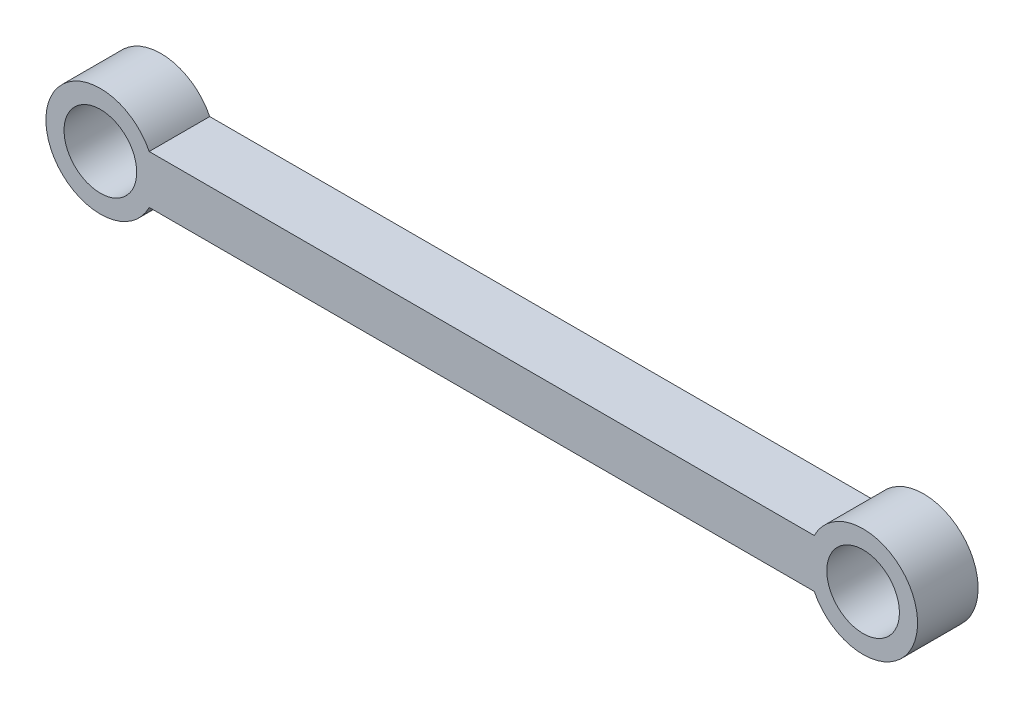
ISO-10303-21;
HEADER;
FILE_DESCRIPTION(('STEP AP214'),'2;1');
FILE_NAME('part.step','',(''),(''),'','','');
FILE_SCHEMA(('AUTOMOTIVE_DESIGN { 1 0 10303 214 1 1 1 1 }'));
ENDSEC;
DATA;
#1=APPLICATION_CONTEXT('core data for automotive mechanical design processes');
#2=APPLICATION_PROTOCOL_DEFINITION('international standard','automotive_design',2000,#1);
#3=PRODUCT_CONTEXT('',#1,'mechanical');
#4=PRODUCT('Part','Part','',(#3));
#5=PRODUCT_RELATED_PRODUCT_CATEGORY('part','',(#4));
#6=PRODUCT_DEFINITION_FORMATION('','',#4);
#7=PRODUCT_DEFINITION_CONTEXT('part definition',#1,'design');
#8=PRODUCT_DEFINITION('design','',#6,#7);
#9=PRODUCT_DEFINITION_SHAPE('','',#8);
#10=(LENGTH_UNIT() NAMED_UNIT(*) SI_UNIT(.MILLI.,.METRE.));
#11=(NAMED_UNIT(*) PLANE_ANGLE_UNIT() SI_UNIT($,.RADIAN.));
#12=(NAMED_UNIT(*) SI_UNIT($,.STERADIAN.) SOLID_ANGLE_UNIT());
#13=UNCERTAINTY_MEASURE_WITH_UNIT(LENGTH_MEASURE(1.E-05),#10,'distance_accuracy_value','');
#14=(GEOMETRIC_REPRESENTATION_CONTEXT(3) GLOBAL_UNCERTAINTY_ASSIGNED_CONTEXT((#13)) GLOBAL_UNIT_ASSIGNED_CONTEXT((#10,
#11,#12)) REPRESENTATION_CONTEXT('',''));
#15=CARTESIAN_POINT('',(0.,0.,0.));
#16=DIRECTION('',(0.,0.,1.));
#17=DIRECTION('',(1.,0.,0.));
#18=AXIS2_PLACEMENT_3D('',#15,#16,#17);
#19=CARTESIAN_POINT('',(0.,0.,6.35));
#20=DIRECTION('',(0.,0.,1.));
#21=DIRECTION('',(1.,0.,0.));
#22=AXIS2_PLACEMENT_3D('',#19,#20,#21);
#23=PLANE('',#22);
#24=CARTESIAN_POINT('',(0.,0.,6.35));
#25=DIRECTION('',(0.,0.,1.));
#26=DIRECTION('',(1.,0.,0.));
#27=AXIS2_PLACEMENT_3D('',#24,#25,#26);
#28=CIRCLE('',#27,3.81);
#29=CARTESIAN_POINT('',(3.81,0.,6.35));
#30=VERTEX_POINT('',#29);
#31=EDGE_CURVE('E100',#30,#30,#28,.T.);
#32=ORIENTED_EDGE('',*,*,#31,.F.);
#33=EDGE_LOOP('',(#32));
#34=FACE_BOUND('',#33,.T.);
#35=CARTESIAN_POINT('',(0.,0.,6.35));
#36=DIRECTION('',(0.,0.,1.));
#37=DIRECTION('',(1.,0.,0.));
#38=AXIS2_PLACEMENT_3D('',#35,#36,#37);
#39=CIRCLE('',#38,5.715);
#40=CARTESIAN_POINT('',(5.11953367016958,2.54,6.35));
#41=VERTEX_POINT('',#40);
#42=CARTESIAN_POINT('',(5.11953367016958,-2.54,6.35));
#43=VERTEX_POINT('',#42);
#44=EDGE_CURVE('E85',#41,#43,#39,.T.);
#45=ORIENTED_EDGE('',*,*,#44,.T.);
#46=DIRECTION('',(1.,0.,0.));
#47=VECTOR('',#46,1.);
#48=CARTESIAN_POINT('',(5.11953367016958,-2.54,6.35));
#49=LINE('',#48,#47);
#50=CARTESIAN_POINT('',(74.8904663298304,-2.54,6.35));
#51=VERTEX_POINT('',#50);
#52=EDGE_CURVE('E80',#43,#51,#49,.T.);
#53=ORIENTED_EDGE('',*,*,#52,.T.);
#54=CARTESIAN_POINT('',(80.01,0.,6.35));
#55=DIRECTION('',(0.,0.,1.));
#56=DIRECTION('',(1.,0.,0.));
#57=AXIS2_PLACEMENT_3D('',#54,#55,#56);
#58=CIRCLE('',#57,5.71499999999999);
#59=CARTESIAN_POINT('',(74.8904663298304,2.54,6.35));
#60=VERTEX_POINT('',#59);
#61=EDGE_CURVE('E83',#51,#60,#58,.T.);
#62=ORIENTED_EDGE('',*,*,#61,.T.);
#63=DIRECTION('',(-1.,0.,0.));
#64=VECTOR('',#63,1.);
#65=CARTESIAN_POINT('',(5.11953367016958,2.54,6.35));
#66=LINE('',#65,#64);
#67=EDGE_CURVE('E50',#60,#41,#66,.T.);
#68=ORIENTED_EDGE('',*,*,#67,.T.);
#69=EDGE_LOOP('',(#45,#53,#62,#68));
#70=FACE_BOUND('',#69,.T.);
#71=CARTESIAN_POINT('',(80.01,0.,6.35));
#72=DIRECTION('',(0.,0.,1.));
#73=DIRECTION('',(1.,0.,0.));
#74=AXIS2_PLACEMENT_3D('',#71,#72,#73);
#75=CIRCLE('',#74,3.81);
#76=CARTESIAN_POINT('',(83.82,0.,6.35));
#77=VERTEX_POINT('',#76);
#78=EDGE_CURVE('E115',#77,#77,#75,.T.);
#79=ORIENTED_EDGE('',*,*,#78,.F.);
#80=EDGE_LOOP('',(#79));
#81=FACE_BOUND('',#80,.T.);
#82=ADVANCED_FACE('F33',(#34,#70,#81),#23,.T.);
#83=CARTESIAN_POINT('',(0.,0.,0.));
#84=DIRECTION('',(0.,0.,1.));
#85=DIRECTION('',(1.,0.,0.));
#86=AXIS2_PLACEMENT_3D('',#83,#84,#85);
#87=PLANE('',#86);
#88=CARTESIAN_POINT('',(0.,0.,0.));
#89=DIRECTION('',(0.,0.,1.));
#90=DIRECTION('',(1.,0.,0.));
#91=AXIS2_PLACEMENT_3D('',#88,#89,#90);
#92=CIRCLE('',#91,5.715);
#93=CARTESIAN_POINT('',(5.11953367016958,2.54,0.));
#94=VERTEX_POINT('',#93);
#95=CARTESIAN_POINT('',(5.11953367016958,-2.54,0.));
#96=VERTEX_POINT('',#95);
#97=EDGE_CURVE('E97',#94,#96,#92,.T.);
#98=ORIENTED_EDGE('',*,*,#97,.F.);
#99=DIRECTION('',(-1.,0.,0.));
#100=VECTOR('',#99,1.);
#101=CARTESIAN_POINT('',(5.11953367016958,2.54,0.));
#102=LINE('',#101,#100);
#103=CARTESIAN_POINT('',(74.8904663298304,2.54,0.));
#104=VERTEX_POINT('',#103);
#105=EDGE_CURVE('E73',#104,#94,#102,.T.);
#106=ORIENTED_EDGE('',*,*,#105,.F.);
#107=CARTESIAN_POINT('',(80.01,0.,0.));
#108=DIRECTION('',(0.,0.,1.));
#109=DIRECTION('',(1.,0.,0.));
#110=AXIS2_PLACEMENT_3D('',#107,#108,#109);
#111=CIRCLE('',#110,5.71499999999999);
#112=CARTESIAN_POINT('',(74.8904663298304,-2.54,0.));
#113=VERTEX_POINT('',#112);
#114=EDGE_CURVE('E67',#113,#104,#111,.T.);
#115=ORIENTED_EDGE('',*,*,#114,.F.);
#116=DIRECTION('',(1.,0.,0.));
#117=VECTOR('',#116,1.);
#118=CARTESIAN_POINT('',(5.11953367016958,-2.54,0.));
#119=LINE('',#118,#117);
#120=EDGE_CURVE('E89',#96,#113,#119,.T.);
#121=ORIENTED_EDGE('',*,*,#120,.F.);
#122=EDGE_LOOP('',(#98,#106,#115,#121));
#123=FACE_BOUND('',#122,.T.);
#124=CARTESIAN_POINT('',(0.,0.,0.));
#125=DIRECTION('',(0.,0.,1.));
#126=DIRECTION('',(1.,0.,0.));
#127=AXIS2_PLACEMENT_3D('',#124,#125,#126);
#128=CIRCLE('',#127,3.81);
#129=CARTESIAN_POINT('',(3.81,0.,0.));
#130=VERTEX_POINT('',#129);
#131=EDGE_CURVE('E112',#130,#130,#128,.T.);
#132=ORIENTED_EDGE('',*,*,#131,.T.);
#133=EDGE_LOOP('',(#132));
#134=FACE_BOUND('',#133,.T.);
#135=CARTESIAN_POINT('',(80.01,0.,0.));
#136=DIRECTION('',(0.,0.,1.));
#137=DIRECTION('',(1.,0.,0.));
#138=AXIS2_PLACEMENT_3D('',#135,#136,#137);
#139=CIRCLE('',#138,3.81);
#140=CARTESIAN_POINT('',(83.82,0.,0.));
#141=VERTEX_POINT('',#140);
#142=EDGE_CURVE('E118',#141,#141,#139,.T.);
#143=ORIENTED_EDGE('',*,*,#142,.T.);
#144=EDGE_LOOP('',(#143));
#145=FACE_BOUND('',#144,.T.);
#146=ADVANCED_FACE('F108',(#123,#134,#145),#87,.F.);
#147=CARTESIAN_POINT('',(0.,0.,6.35));
#148=DIRECTION('',(0.,0.,-1.));
#149=DIRECTION('',(-1.,0.,0.));
#150=AXIS2_PLACEMENT_3D('',#147,#148,#149);
#151=CYLINDRICAL_SURFACE('',#150,5.715);
#152=ORIENTED_EDGE('',*,*,#97,.T.);
#153=DIRECTION('',(0.,0.,-1.));
#154=VECTOR('',#153,1.);
#155=CARTESIAN_POINT('',(5.11953367016958,-2.54,6.35));
#156=LINE('',#155,#154);
#157=EDGE_CURVE('E11',#43,#96,#156,.T.);
#158=ORIENTED_EDGE('',*,*,#157,.F.);
#159=ORIENTED_EDGE('',*,*,#44,.F.);
#160=DIRECTION('',(0.,0.,-1.));
#161=VECTOR('',#160,1.);
#162=CARTESIAN_POINT('',(5.11953367016958,2.54,6.35));
#163=LINE('',#162,#161);
#164=EDGE_CURVE('E93',#41,#94,#163,.T.);
#165=ORIENTED_EDGE('',*,*,#164,.T.);
#166=EDGE_LOOP('',(#152,#158,#159,#165));
#167=FACE_BOUND('',#166,.T.);
#168=ADVANCED_FACE('F35',(#167),#151,.T.);
#169=CARTESIAN_POINT('',(5.11953367016958,-2.54,6.35));
#170=DIRECTION('',(0.,1.,0.));
#171=DIRECTION('',(0.,0.,1.));
#172=AXIS2_PLACEMENT_3D('',#169,#170,#171);
#173=PLANE('',#172);
#174=ORIENTED_EDGE('',*,*,#120,.T.);
#175=DIRECTION('',(0.,0.,-1.));
#176=VECTOR('',#175,1.);
#177=CARTESIAN_POINT('',(74.8904663298304,-2.54,6.35));
#178=LINE('',#177,#176);
#179=EDGE_CURVE('E42',#51,#113,#178,.T.);
#180=ORIENTED_EDGE('',*,*,#179,.F.);
#181=ORIENTED_EDGE('',*,*,#52,.F.);
#182=ORIENTED_EDGE('',*,*,#157,.T.);
#183=EDGE_LOOP('',(#174,#180,#181,#182));
#184=FACE_BOUND('',#183,.T.);
#185=ADVANCED_FACE('F88',(#184),#173,.F.);
#186=CARTESIAN_POINT('',(80.01,0.,6.35));
#187=DIRECTION('',(0.,0.,-1.));
#188=DIRECTION('',(-1.,0.,0.));
#189=AXIS2_PLACEMENT_3D('',#186,#187,#188);
#190=CYLINDRICAL_SURFACE('',#189,5.71499999999999);
#191=ORIENTED_EDGE('',*,*,#114,.T.);
#192=DIRECTION('',(0.,0.,-1.));
#193=VECTOR('',#192,1.);
#194=CARTESIAN_POINT('',(74.8904663298304,2.54,6.35));
#195=LINE('',#194,#193);
#196=EDGE_CURVE('E90',#60,#104,#195,.T.);
#197=ORIENTED_EDGE('',*,*,#196,.F.);
#198=ORIENTED_EDGE('',*,*,#61,.F.);
#199=ORIENTED_EDGE('',*,*,#179,.T.);
#200=EDGE_LOOP('',(#191,#197,#198,#199));
#201=FACE_BOUND('',#200,.T.);
#202=ADVANCED_FACE('F91',(#201),#190,.T.);
#203=CARTESIAN_POINT('',(5.11953367016958,2.54,6.35));
#204=DIRECTION('',(0.,-1.,0.));
#205=DIRECTION('',(0.,0.,-1.));
#206=AXIS2_PLACEMENT_3D('',#203,#204,#205);
#207=PLANE('',#206);
#208=ORIENTED_EDGE('',*,*,#105,.T.);
#209=ORIENTED_EDGE('',*,*,#164,.F.);
#210=ORIENTED_EDGE('',*,*,#67,.F.);
#211=ORIENTED_EDGE('',*,*,#196,.T.);
#212=EDGE_LOOP('',(#208,#209,#210,#211));
#213=FACE_BOUND('',#212,.T.);
#214=ADVANCED_FACE('F105',(#213),#207,.F.);
#215=CARTESIAN_POINT('',(0.,0.,6.35));
#216=DIRECTION('',(0.,0.,-1.));
#217=DIRECTION('',(-1.,0.,0.));
#218=AXIS2_PLACEMENT_3D('',#215,#216,#217);
#219=CYLINDRICAL_SURFACE('',#218,3.81);
#220=ORIENTED_EDGE('',*,*,#31,.T.);
#221=EDGE_LOOP('',(#220));
#222=FACE_BOUND('',#221,.T.);
#223=ORIENTED_EDGE('',*,*,#131,.F.);
#224=EDGE_LOOP('',(#223));
#225=FACE_BOUND('',#224,.T.);
#226=ADVANCED_FACE('F135',(#222,#225),#219,.F.);
#227=CARTESIAN_POINT('',(80.01,0.,6.35));
#228=DIRECTION('',(0.,0.,-1.));
#229=DIRECTION('',(-1.,0.,0.));
#230=AXIS2_PLACEMENT_3D('',#227,#228,#229);
#231=CYLINDRICAL_SURFACE('',#230,3.81);
#232=ORIENTED_EDGE('',*,*,#78,.T.);
#233=EDGE_LOOP('',(#232));
#234=FACE_BOUND('',#233,.T.);
#235=ORIENTED_EDGE('',*,*,#142,.F.);
#236=EDGE_LOOP('',(#235));
#237=FACE_BOUND('',#236,.T.);
#238=ADVANCED_FACE('F124',(#234,#237),#231,.F.);
#239=CLOSED_SHELL('',(#82,#146,#168,#185,#202,#214,#226,#238));
#240=MANIFOLD_SOLID_BREP('B2',#239);
#241=ADVANCED_BREP_SHAPE_REPRESENTATION('',(#18,#240),#14);
#242=SHAPE_DEFINITION_REPRESENTATION(#9,#241);
ENDSEC;
END-ISO-10303-21;
